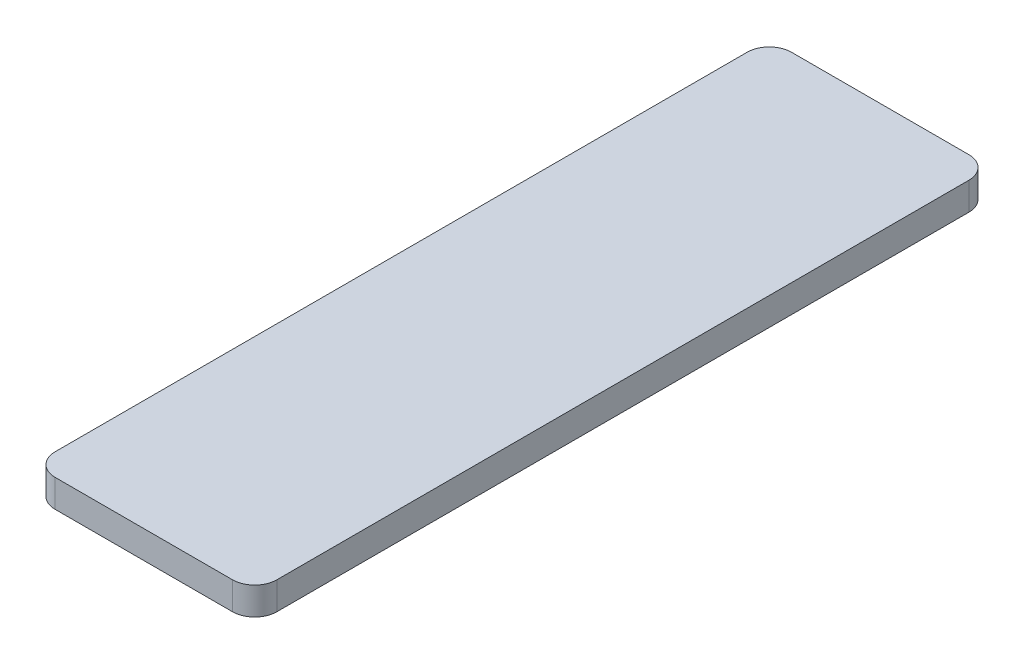
ISO-10303-21;
HEADER;
FILE_DESCRIPTION(('STEP AP214'),'2;1');
FILE_NAME('part.step','',(''),(''),'','','');
FILE_SCHEMA(('AUTOMOTIVE_DESIGN { 1 0 10303 214 1 1 1 1 }'));
ENDSEC;
DATA;
#1=APPLICATION_CONTEXT('core data for automotive mechanical design processes');
#2=APPLICATION_PROTOCOL_DEFINITION('international standard','automotive_design',2000,#1);
#3=PRODUCT_CONTEXT('',#1,'mechanical');
#4=PRODUCT('Part','Part','',(#3));
#5=PRODUCT_RELATED_PRODUCT_CATEGORY('part','',(#4));
#6=PRODUCT_DEFINITION_FORMATION('','',#4);
#7=PRODUCT_DEFINITION_CONTEXT('part definition',#1,'design');
#8=PRODUCT_DEFINITION('design','',#6,#7);
#9=PRODUCT_DEFINITION_SHAPE('','',#8);
#10=(LENGTH_UNIT() NAMED_UNIT(*) SI_UNIT(.MILLI.,.METRE.));
#11=(NAMED_UNIT(*) PLANE_ANGLE_UNIT() SI_UNIT($,.RADIAN.));
#12=(NAMED_UNIT(*) SI_UNIT($,.STERADIAN.) SOLID_ANGLE_UNIT());
#13=UNCERTAINTY_MEASURE_WITH_UNIT(LENGTH_MEASURE(1.E-05),#10,'distance_accuracy_value','');
#14=(GEOMETRIC_REPRESENTATION_CONTEXT(3) GLOBAL_UNCERTAINTY_ASSIGNED_CONTEXT((#13)) GLOBAL_UNIT_ASSIGNED_CONTEXT((#10,
#11,#12)) REPRESENTATION_CONTEXT('',''));
#15=CARTESIAN_POINT('',(0.,0.,0.));
#16=DIRECTION('',(0.,0.,1.));
#17=DIRECTION('',(1.,0.,0.));
#18=AXIS2_PLACEMENT_3D('',#15,#16,#17);
#19=CARTESIAN_POINT('',(0.,3.175,0.));
#20=DIRECTION('',(1.,0.,0.));
#21=DIRECTION('',(0.,0.,-1.));
#22=AXIS2_PLACEMENT_3D('',#19,#20,#21);
#23=PLANE('',#22);
#24=DIRECTION('',(0.,0.,1.));
#25=VECTOR('',#24,1.);
#26=CARTESIAN_POINT('',(0.,0.,0.));
#27=LINE('',#26,#25);
#28=CARTESIAN_POINT('',(0.,0.,-81.81));
#29=VERTEX_POINT('',#28);
#30=CARTESIAN_POINT('',(0.,0.,-2.54));
#31=VERTEX_POINT('',#30);
#32=EDGE_CURVE('E145',#29,#31,#27,.T.);
#33=ORIENTED_EDGE('',*,*,#32,.T.);
#34=DIRECTION('',(0.,-1.,0.));
#35=VECTOR('',#34,1.);
#36=CARTESIAN_POINT('',(0.,3.175,-2.54));
#37=LINE('',#36,#35);
#38=CARTESIAN_POINT('',(0.,3.175,-2.54));
#39=VERTEX_POINT('',#38);
#40=EDGE_CURVE('E178',#31,#39,#37,.F.);
#41=ORIENTED_EDGE('',*,*,#40,.T.);
#42=DIRECTION('',(0.,0.,1.));
#43=VECTOR('',#42,1.);
#44=CARTESIAN_POINT('',(0.,3.175,0.));
#45=LINE('',#44,#43);
#46=CARTESIAN_POINT('',(0.,3.175,-81.81));
#47=VERTEX_POINT('',#46);
#48=EDGE_CURVE('E143',#47,#39,#45,.T.);
#49=ORIENTED_EDGE('',*,*,#48,.F.);
#50=DIRECTION('',(0.,-1.,0.));
#51=VECTOR('',#50,1.);
#52=CARTESIAN_POINT('',(0.,3.175,-81.81));
#53=LINE('',#52,#51);
#54=EDGE_CURVE('E174',#47,#29,#53,.T.);
#55=ORIENTED_EDGE('',*,*,#54,.T.);
#56=EDGE_LOOP('',(#33,#41,#49,#55));
#57=FACE_BOUND('',#56,.T.);
#58=ADVANCED_FACE('F42',(#57),#23,.F.);
#59=CARTESIAN_POINT('',(0.,3.175,0.));
#60=DIRECTION('',(0.,0.,-1.));
#61=DIRECTION('',(-1.,0.,0.));
#62=AXIS2_PLACEMENT_3D('',#59,#60,#61);
#63=PLANE('',#62);
#64=DIRECTION('',(1.,0.,0.));
#65=VECTOR('',#64,1.);
#66=CARTESIAN_POINT('',(0.,0.,0.));
#67=LINE('',#66,#65);
#68=CARTESIAN_POINT('',(2.54,0.,0.));
#69=VERTEX_POINT('',#68);
#70=CARTESIAN_POINT('',(22.86,0.,0.));
#71=VERTEX_POINT('',#70);
#72=EDGE_CURVE('E139',#69,#71,#67,.T.);
#73=ORIENTED_EDGE('',*,*,#72,.T.);
#74=DIRECTION('',(0.,-1.,0.));
#75=VECTOR('',#74,1.);
#76=CARTESIAN_POINT('',(22.86,3.175,0.));
#77=LINE('',#76,#75);
#78=CARTESIAN_POINT('',(22.86,3.175,0.));
#79=VERTEX_POINT('',#78);
#80=EDGE_CURVE('E114',#71,#79,#77,.F.);
#81=ORIENTED_EDGE('',*,*,#80,.T.);
#82=DIRECTION('',(1.,0.,0.));
#83=VECTOR('',#82,1.);
#84=CARTESIAN_POINT('',(0.,3.175,0.));
#85=LINE('',#84,#83);
#86=CARTESIAN_POINT('',(2.54,3.175,0.));
#87=VERTEX_POINT('',#86);
#88=EDGE_CURVE('E185',#87,#79,#85,.T.);
#89=ORIENTED_EDGE('',*,*,#88,.F.);
#90=DIRECTION('',(0.,-1.,0.));
#91=VECTOR('',#90,1.);
#92=CARTESIAN_POINT('',(2.54,3.175,0.));
#93=LINE('',#92,#91);
#94=EDGE_CURVE('E120',#87,#69,#93,.T.);
#95=ORIENTED_EDGE('',*,*,#94,.T.);
#96=EDGE_LOOP('',(#73,#81,#89,#95));
#97=FACE_BOUND('',#96,.T.);
#98=ADVANCED_FACE('F206',(#97),#63,.F.);
#99=CARTESIAN_POINT('',(25.4,3.175,0.));
#100=DIRECTION('',(-1.,0.,0.));
#101=DIRECTION('',(0.,0.,1.));
#102=AXIS2_PLACEMENT_3D('',#99,#100,#101);
#103=PLANE('',#102);
#104=DIRECTION('',(0.,0.,-1.));
#105=VECTOR('',#104,1.);
#106=CARTESIAN_POINT('',(25.4,3.175,0.));
#107=LINE('',#106,#105);
#108=CARTESIAN_POINT('',(25.4,3.175,-2.54));
#109=VERTEX_POINT('',#108);
#110=CARTESIAN_POINT('',(25.4,3.175,-81.81));
#111=VERTEX_POINT('',#110);
#112=EDGE_CURVE('E129',#109,#111,#107,.T.);
#113=ORIENTED_EDGE('',*,*,#112,.F.);
#114=DIRECTION('',(0.,-1.,0.));
#115=VECTOR('',#114,1.);
#116=CARTESIAN_POINT('',(25.4,3.175,-2.54));
#117=LINE('',#116,#115);
#118=CARTESIAN_POINT('',(25.4,0.,-2.54));
#119=VERTEX_POINT('',#118);
#120=EDGE_CURVE('E113',#109,#119,#117,.T.);
#121=ORIENTED_EDGE('',*,*,#120,.T.);
#122=DIRECTION('',(0.,0.,-1.));
#123=VECTOR('',#122,1.);
#124=CARTESIAN_POINT('',(25.4,0.,0.));
#125=LINE('',#124,#123);
#126=CARTESIAN_POINT('',(25.4,0.,-81.81));
#127=VERTEX_POINT('',#126);
#128=EDGE_CURVE('E127',#119,#127,#125,.T.);
#129=ORIENTED_EDGE('',*,*,#128,.T.);
#130=DIRECTION('',(0.,-1.,0.));
#131=VECTOR('',#130,1.);
#132=CARTESIAN_POINT('',(25.4,3.175,-81.81));
#133=LINE('',#132,#131);
#134=EDGE_CURVE('E132',#127,#111,#133,.F.);
#135=ORIENTED_EDGE('',*,*,#134,.T.);
#136=EDGE_LOOP('',(#113,#121,#129,#135));
#137=FACE_BOUND('',#136,.T.);
#138=ADVANCED_FACE('F126',(#137),#103,.F.);
#139=CARTESIAN_POINT('',(0.,3.175,-84.35));
#140=DIRECTION('',(0.,0.,1.));
#141=DIRECTION('',(1.,0.,0.));
#142=AXIS2_PLACEMENT_3D('',#139,#140,#141);
#143=PLANE('',#142);
#144=DIRECTION('',(-1.,0.,0.));
#145=VECTOR('',#144,1.);
#146=CARTESIAN_POINT('',(0.,3.175,-84.35));
#147=LINE('',#146,#145);
#148=CARTESIAN_POINT('',(22.86,3.175,-84.35));
#149=VERTEX_POINT('',#148);
#150=CARTESIAN_POINT('',(2.54,3.175,-84.35));
#151=VERTEX_POINT('',#150);
#152=EDGE_CURVE('E150',#149,#151,#147,.T.);
#153=ORIENTED_EDGE('',*,*,#152,.F.);
#154=DIRECTION('',(0.,-1.,0.));
#155=VECTOR('',#154,1.);
#156=CARTESIAN_POINT('',(22.86,3.175,-84.35));
#157=LINE('',#156,#155);
#158=CARTESIAN_POINT('',(22.86,0.,-84.35));
#159=VERTEX_POINT('',#158);
#160=EDGE_CURVE('E11',#149,#159,#157,.T.);
#161=ORIENTED_EDGE('',*,*,#160,.T.);
#162=DIRECTION('',(-1.,0.,0.));
#163=VECTOR('',#162,1.);
#164=CARTESIAN_POINT('',(0.,0.,-84.35));
#165=LINE('',#164,#163);
#166=CARTESIAN_POINT('',(2.54,0.,-84.35));
#167=VERTEX_POINT('',#166);
#168=EDGE_CURVE('E138',#159,#167,#165,.T.);
#169=ORIENTED_EDGE('',*,*,#168,.T.);
#170=DIRECTION('',(0.,-1.,0.));
#171=VECTOR('',#170,1.);
#172=CARTESIAN_POINT('',(2.54,3.175,-84.35));
#173=LINE('',#172,#171);
#174=EDGE_CURVE('E51',#167,#151,#173,.F.);
#175=ORIENTED_EDGE('',*,*,#174,.T.);
#176=EDGE_LOOP('',(#153,#161,#169,#175));
#177=FACE_BOUND('',#176,.T.);
#178=ADVANCED_FACE('F213',(#177),#143,.F.);
#179=CARTESIAN_POINT('',(0.,3.175,0.));
#180=DIRECTION('',(0.,-1.,0.));
#181=DIRECTION('',(0.,0.,-1.));
#182=AXIS2_PLACEMENT_3D('',#179,#180,#181);
#183=PLANE('',#182);
#184=ORIENTED_EDGE('',*,*,#88,.T.);
#185=CARTESIAN_POINT('',(22.86,3.175,-2.54));
#186=DIRECTION('',(0.,-1.,0.));
#187=DIRECTION('',(0.,0.,-1.));
#188=AXIS2_PLACEMENT_3D('',#185,#186,#187);
#189=CIRCLE('',#188,2.54);
#190=EDGE_CURVE('E171',#79,#109,#189,.F.);
#191=ORIENTED_EDGE('',*,*,#190,.T.);
#192=ORIENTED_EDGE('',*,*,#112,.T.);
#193=CARTESIAN_POINT('',(22.86,3.175,-81.81));
#194=DIRECTION('',(0.,-1.,0.));
#195=DIRECTION('',(0.,0.,-1.));
#196=AXIS2_PLACEMENT_3D('',#193,#194,#195);
#197=CIRCLE('',#196,2.54);
#198=EDGE_CURVE('E64',#111,#149,#197,.F.);
#199=ORIENTED_EDGE('',*,*,#198,.T.);
#200=ORIENTED_EDGE('',*,*,#152,.T.);
#201=CARTESIAN_POINT('',(2.54,3.175,-81.81));
#202=DIRECTION('',(0.,-1.,0.));
#203=DIRECTION('',(0.,0.,-1.));
#204=AXIS2_PLACEMENT_3D('',#201,#202,#203);
#205=CIRCLE('',#204,2.54);
#206=EDGE_CURVE('E163',#151,#47,#205,.F.);
#207=ORIENTED_EDGE('',*,*,#206,.T.);
#208=ORIENTED_EDGE('',*,*,#48,.T.);
#209=CARTESIAN_POINT('',(2.54,3.175,-2.54));
#210=DIRECTION('',(0.,-1.,0.));
#211=DIRECTION('',(0.,0.,-1.));
#212=AXIS2_PLACEMENT_3D('',#209,#210,#211);
#213=CIRCLE('',#212,2.54);
#214=EDGE_CURVE('E168',#39,#87,#213,.F.);
#215=ORIENTED_EDGE('',*,*,#214,.T.);
#216=EDGE_LOOP('',(#184,#191,#192,#199,#200,#207,#208,#215));
#217=FACE_BOUND('',#216,.T.);
#218=ADVANCED_FACE('F204',(#217),#183,.F.);
#219=CARTESIAN_POINT('',(0.,0.,0.));
#220=DIRECTION('',(0.,-1.,0.));
#221=DIRECTION('',(0.,0.,-1.));
#222=AXIS2_PLACEMENT_3D('',#219,#220,#221);
#223=PLANE('',#222);
#224=ORIENTED_EDGE('',*,*,#128,.F.);
#225=CARTESIAN_POINT('',(22.86,0.,-2.54));
#226=DIRECTION('',(0.,-1.,0.));
#227=DIRECTION('',(0.,0.,-1.));
#228=AXIS2_PLACEMENT_3D('',#225,#226,#227);
#229=CIRCLE('',#228,2.54);
#230=EDGE_CURVE('E109',#119,#71,#229,.T.);
#231=ORIENTED_EDGE('',*,*,#230,.T.);
#232=ORIENTED_EDGE('',*,*,#72,.F.);
#233=CARTESIAN_POINT('',(2.54,0.,-2.54));
#234=DIRECTION('',(0.,-1.,0.));
#235=DIRECTION('',(0.,0.,-1.));
#236=AXIS2_PLACEMENT_3D('',#233,#234,#235);
#237=CIRCLE('',#236,2.54);
#238=EDGE_CURVE('E121',#69,#31,#237,.T.);
#239=ORIENTED_EDGE('',*,*,#238,.T.);
#240=ORIENTED_EDGE('',*,*,#32,.F.);
#241=CARTESIAN_POINT('',(2.54,0.,-81.81));
#242=DIRECTION('',(0.,-1.,0.));
#243=DIRECTION('',(0.,0.,-1.));
#244=AXIS2_PLACEMENT_3D('',#241,#242,#243);
#245=CIRCLE('',#244,2.54);
#246=EDGE_CURVE('E131',#29,#167,#245,.T.);
#247=ORIENTED_EDGE('',*,*,#246,.T.);
#248=ORIENTED_EDGE('',*,*,#168,.F.);
#249=CARTESIAN_POINT('',(22.86,0.,-81.81));
#250=DIRECTION('',(0.,-1.,0.));
#251=DIRECTION('',(0.,0.,-1.));
#252=AXIS2_PLACEMENT_3D('',#249,#250,#251);
#253=CIRCLE('',#252,2.54);
#254=EDGE_CURVE('E136',#159,#127,#253,.T.);
#255=ORIENTED_EDGE('',*,*,#254,.T.);
#256=EDGE_LOOP('',(#224,#231,#232,#239,#240,#247,#248,#255));
#257=FACE_BOUND('',#256,.T.);
#258=ADVANCED_FACE('F134',(#257),#223,.T.);
#259=CARTESIAN_POINT('',(22.86,3.175,-2.54));
#260=DIRECTION('',(0.,-1.,0.));
#261=DIRECTION('',(0.,0.,-1.));
#262=AXIS2_PLACEMENT_3D('',#259,#260,#261);
#263=CYLINDRICAL_SURFACE('',#262,2.54);
#264=ORIENTED_EDGE('',*,*,#190,.F.);
#265=ORIENTED_EDGE('',*,*,#80,.F.);
#266=ORIENTED_EDGE('',*,*,#230,.F.);
#267=ORIENTED_EDGE('',*,*,#120,.F.);
#268=EDGE_LOOP('',(#264,#265,#266,#267));
#269=FACE_BOUND('',#268,.T.);
#270=ADVANCED_FACE('F112',(#269),#263,.T.);
#271=CARTESIAN_POINT('',(2.54,3.175,-2.54));
#272=DIRECTION('',(0.,-1.,0.));
#273=DIRECTION('',(0.,0.,-1.));
#274=AXIS2_PLACEMENT_3D('',#271,#272,#273);
#275=CYLINDRICAL_SURFACE('',#274,2.54);
#276=ORIENTED_EDGE('',*,*,#214,.F.);
#277=ORIENTED_EDGE('',*,*,#40,.F.);
#278=ORIENTED_EDGE('',*,*,#238,.F.);
#279=ORIENTED_EDGE('',*,*,#94,.F.);
#280=EDGE_LOOP('',(#276,#277,#278,#279));
#281=FACE_BOUND('',#280,.T.);
#282=ADVANCED_FACE('F201',(#281),#275,.T.);
#283=CARTESIAN_POINT('',(22.86,3.175,-81.81));
#284=DIRECTION('',(0.,-1.,0.));
#285=DIRECTION('',(0.,0.,-1.));
#286=AXIS2_PLACEMENT_3D('',#283,#284,#285);
#287=CYLINDRICAL_SURFACE('',#286,2.54);
#288=ORIENTED_EDGE('',*,*,#198,.F.);
#289=ORIENTED_EDGE('',*,*,#134,.F.);
#290=ORIENTED_EDGE('',*,*,#254,.F.);
#291=ORIENTED_EDGE('',*,*,#160,.F.);
#292=EDGE_LOOP('',(#288,#289,#290,#291));
#293=FACE_BOUND('',#292,.T.);
#294=ADVANCED_FACE('F221',(#293),#287,.T.);
#295=CARTESIAN_POINT('',(2.54,3.175,-81.81));
#296=DIRECTION('',(0.,-1.,0.));
#297=DIRECTION('',(0.,0.,-1.));
#298=AXIS2_PLACEMENT_3D('',#295,#296,#297);
#299=CYLINDRICAL_SURFACE('',#298,2.54);
#300=ORIENTED_EDGE('',*,*,#206,.F.);
#301=ORIENTED_EDGE('',*,*,#174,.F.);
#302=ORIENTED_EDGE('',*,*,#246,.F.);
#303=ORIENTED_EDGE('',*,*,#54,.F.);
#304=EDGE_LOOP('',(#300,#301,#302,#303));
#305=FACE_BOUND('',#304,.T.);
#306=ADVANCED_FACE('F44',(#305),#299,.T.);
#307=CLOSED_SHELL('',(#58,#98,#138,#178,#218,#258,#270,#282,#294,#306));
#308=MANIFOLD_SOLID_BREP('B2',#307);
#309=ADVANCED_BREP_SHAPE_REPRESENTATION('',(#18,#308),#14);
#310=SHAPE_DEFINITION_REPRESENTATION(#9,#309);
ENDSEC;
END-ISO-10303-21;
